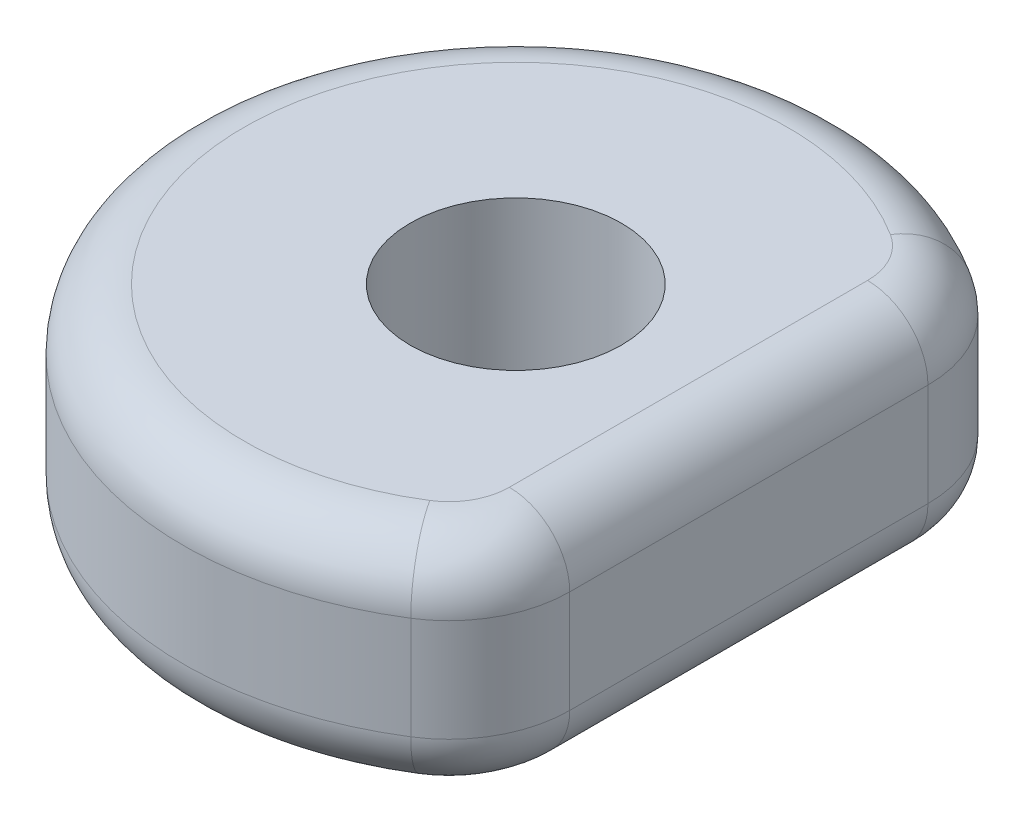
ISO-10303-21;
HEADER;
FILE_DESCRIPTION(('STEP AP214'),'2;1');
FILE_NAME('part.step','',(''),(''),'','','');
FILE_SCHEMA(('AUTOMOTIVE_DESIGN { 1 0 10303 214 1 1 1 1 }'));
ENDSEC;
DATA;
#1=APPLICATION_CONTEXT('core data for automotive mechanical design processes');
#2=APPLICATION_PROTOCOL_DEFINITION('international standard','automotive_design',2000,#1);
#3=PRODUCT_CONTEXT('',#1,'mechanical');
#4=PRODUCT('Part','Part','',(#3));
#5=PRODUCT_RELATED_PRODUCT_CATEGORY('part','',(#4));
#6=PRODUCT_DEFINITION_FORMATION('','',#4);
#7=PRODUCT_DEFINITION_CONTEXT('part definition',#1,'design');
#8=PRODUCT_DEFINITION('design','',#6,#7);
#9=PRODUCT_DEFINITION_SHAPE('','',#8);
#10=(LENGTH_UNIT() NAMED_UNIT(*) SI_UNIT(.MILLI.,.METRE.));
#11=(NAMED_UNIT(*) PLANE_ANGLE_UNIT() SI_UNIT($,.RADIAN.));
#12=(NAMED_UNIT(*) SI_UNIT($,.STERADIAN.) SOLID_ANGLE_UNIT());
#13=UNCERTAINTY_MEASURE_WITH_UNIT(LENGTH_MEASURE(1.E-05),#10,'distance_accuracy_value','');
#14=(GEOMETRIC_REPRESENTATION_CONTEXT(3) GLOBAL_UNCERTAINTY_ASSIGNED_CONTEXT((#13)) GLOBAL_UNIT_ASSIGNED_CONTEXT((#10,
#11,#12)) REPRESENTATION_CONTEXT('',''));
#15=CARTESIAN_POINT('',(0.,0.,0.));
#16=DIRECTION('',(0.,0.,1.));
#17=DIRECTION('',(1.,0.,0.));
#18=AXIS2_PLACEMENT_3D('',#15,#16,#17);
#19=CARTESIAN_POINT('',(0.,3.7,0.));
#20=DIRECTION('',(0.,1.,0.));
#21=DIRECTION('',(0.,0.,1.));
#22=AXIS2_PLACEMENT_3D('',#19,#20,#21);
#23=PLANE('',#22);
#24=DIRECTION('',(0.,0.,-1.));
#25=VECTOR('',#24,1.);
#26=CARTESIAN_POINT('',(2.85898782403715,3.7,-2.96549561963622));
#27=LINE('',#26,#25);
#28=CARTESIAN_POINT('',(2.85898782403715,3.7,2.96549561963622));
#29=VERTEX_POINT('',#28);
#30=CARTESIAN_POINT('',(2.85898782403715,3.7,-2.96549561963622));
#31=VERTEX_POINT('',#30);
#32=EDGE_CURVE('E142',#29,#31,#27,.T.);
#33=ORIENTED_EDGE('',*,*,#32,.T.);
#34=CARTESIAN_POINT('',(1.85898782403715,3.7,-2.96549561963622));
#35=DIRECTION('',(0.,1.,0.));
#36=DIRECTION('',(0.,0.,1.));
#37=AXIS2_PLACEMENT_3D('',#34,#35,#36);
#38=CIRCLE('',#37,1.);
#39=CARTESIAN_POINT('',(2.39012720233348,3.7,-3.81278008238943));
#40=VERTEX_POINT('',#39);
#41=EDGE_CURVE('E121',#31,#40,#38,.T.);
#42=ORIENTED_EDGE('',*,*,#41,.T.);
#43=CARTESIAN_POINT('',(0.,3.7,0.));
#44=DIRECTION('',(0.,1.,0.));
#45=DIRECTION('',(0.,0.,1.));
#46=AXIS2_PLACEMENT_3D('',#43,#44,#45);
#47=CIRCLE('',#46,4.5);
#48=CARTESIAN_POINT('',(2.39012720233348,3.7,3.81278008238943));
#49=VERTEX_POINT('',#48);
#50=EDGE_CURVE('E130',#40,#49,#47,.T.);
#51=ORIENTED_EDGE('',*,*,#50,.T.);
#52=CARTESIAN_POINT('',(1.85898782403715,3.7,2.96549561963622));
#53=DIRECTION('',(0.,1.,0.));
#54=DIRECTION('',(0.,0.,1.));
#55=AXIS2_PLACEMENT_3D('',#52,#53,#54);
#56=CIRCLE('',#55,1.);
#57=EDGE_CURVE('E137',#49,#29,#56,.T.);
#58=ORIENTED_EDGE('',*,*,#57,.T.);
#59=EDGE_LOOP('',(#33,#42,#51,#58));
#60=FACE_BOUND('',#59,.T.);
#61=CARTESIAN_POINT('',(0.,3.7,0.));
#62=DIRECTION('',(0.,1.,0.));
#63=DIRECTION('',(0.,0.,1.));
#64=AXIS2_PLACEMENT_3D('',#61,#62,#63);
#65=CIRCLE('',#64,1.75);
#66=CARTESIAN_POINT('',(0.,3.7,1.75));
#67=VERTEX_POINT('',#66);
#68=EDGE_CURVE('E231',#67,#67,#65,.T.);
#69=ORIENTED_EDGE('',*,*,#68,.F.);
#70=EDGE_LOOP('',(#69));
#71=FACE_BOUND('',#70,.T.);
#72=ADVANCED_FACE('F47',(#60,#71),#23,.T.);
#73=CARTESIAN_POINT('',(0.,0.,0.));
#74=DIRECTION('',(0.,1.,0.));
#75=DIRECTION('',(0.,0.,1.));
#76=AXIS2_PLACEMENT_3D('',#73,#74,#75);
#77=PLANE('',#76);
#78=CARTESIAN_POINT('',(0.,0.,0.));
#79=DIRECTION('',(0.,1.,0.));
#80=DIRECTION('',(0.,0.,1.));
#81=AXIS2_PLACEMENT_3D('',#78,#79,#80);
#82=CIRCLE('',#81,4.5);
#83=CARTESIAN_POINT('',(2.39012720233348,0.,3.81278008238943));
#84=VERTEX_POINT('',#83);
#85=CARTESIAN_POINT('',(2.39012720233348,0.,-3.81278008238943));
#86=VERTEX_POINT('',#85);
#87=EDGE_CURVE('E168',#84,#86,#82,.F.);
#88=ORIENTED_EDGE('',*,*,#87,.T.);
#89=CARTESIAN_POINT('',(1.85898782403715,0.,-2.96549561963622));
#90=DIRECTION('',(0.,1.,0.));
#91=DIRECTION('',(0.,0.,1.));
#92=AXIS2_PLACEMENT_3D('',#89,#90,#91);
#93=CIRCLE('',#92,1.);
#94=CARTESIAN_POINT('',(2.85898782403715,0.,-2.96549561963622));
#95=VERTEX_POINT('',#94);
#96=EDGE_CURVE('E176',#86,#95,#93,.F.);
#97=ORIENTED_EDGE('',*,*,#96,.T.);
#98=DIRECTION('',(0.,0.,-1.));
#99=VECTOR('',#98,1.);
#100=CARTESIAN_POINT('',(2.85898782403715,0.,0.));
#101=LINE('',#100,#99);
#102=CARTESIAN_POINT('',(2.85898782403715,0.,2.96549561963622));
#103=VERTEX_POINT('',#102);
#104=EDGE_CURVE('E72',#95,#103,#101,.F.);
#105=ORIENTED_EDGE('',*,*,#104,.T.);
#106=CARTESIAN_POINT('',(1.85898782403715,0.,2.96549561963622));
#107=DIRECTION('',(0.,1.,0.));
#108=DIRECTION('',(0.,0.,1.));
#109=AXIS2_PLACEMENT_3D('',#106,#107,#108);
#110=CIRCLE('',#109,1.);
#111=EDGE_CURVE('E171',#103,#84,#110,.F.);
#112=ORIENTED_EDGE('',*,*,#111,.T.);
#113=EDGE_LOOP('',(#88,#97,#105,#112));
#114=FACE_BOUND('',#113,.T.);
#115=CARTESIAN_POINT('',(0.,0.,0.));
#116=DIRECTION('',(0.,1.,0.));
#117=DIRECTION('',(0.,0.,1.));
#118=AXIS2_PLACEMENT_3D('',#115,#116,#117);
#119=CIRCLE('',#118,1.75);
#120=CARTESIAN_POINT('',(0.,0.,1.75));
#121=VERTEX_POINT('',#120);
#122=EDGE_CURVE('E189',#121,#121,#119,.T.);
#123=ORIENTED_EDGE('',*,*,#122,.T.);
#124=EDGE_LOOP('',(#123));
#125=FACE_BOUND('',#124,.T.);
#126=ADVANCED_FACE('F248',(#114,#125),#77,.F.);
#127=CARTESIAN_POINT('',(0.,3.7,0.));
#128=DIRECTION('',(0.,-1.,0.));
#129=DIRECTION('',(0.,0.,-1.));
#130=AXIS2_PLACEMENT_3D('',#127,#128,#129);
#131=CYLINDRICAL_SURFACE('',#130,5.5);
#132=DIRECTION('',(0.,-1.,0.));
#133=VECTOR('',#132,1.);
#134=CARTESIAN_POINT('',(2.92126658062981,3.7,4.66006454514263));
#135=LINE('',#134,#133);
#136=CARTESIAN_POINT('',(2.92126658062981,1.,4.66006454514263));
#137=VERTEX_POINT('',#136);
#138=CARTESIAN_POINT('',(2.92126658062981,2.7,4.66006454514263));
#139=VERTEX_POINT('',#138);
#140=EDGE_CURVE('E138',#137,#139,#135,.F.);
#141=ORIENTED_EDGE('',*,*,#140,.T.);
#142=CARTESIAN_POINT('',(0.,2.7,0.));
#143=DIRECTION('',(0.,1.,0.));
#144=DIRECTION('',(0.,0.,1.));
#145=AXIS2_PLACEMENT_3D('',#142,#143,#144);
#146=CIRCLE('',#145,5.5);
#147=CARTESIAN_POINT('',(2.92126658062981,2.7,-4.66006454514263));
#148=VERTEX_POINT('',#147);
#149=EDGE_CURVE('E11',#139,#148,#146,.F.);
#150=ORIENTED_EDGE('',*,*,#149,.T.);
#151=DIRECTION('',(0.,-1.,0.));
#152=VECTOR('',#151,1.);
#153=CARTESIAN_POINT('',(2.92126658062981,3.7,-4.66006454514263));
#154=LINE('',#153,#152);
#155=CARTESIAN_POINT('',(2.92126658062981,1.,-4.66006454514263));
#156=VERTEX_POINT('',#155);
#157=EDGE_CURVE('E224',#148,#156,#154,.T.);
#158=ORIENTED_EDGE('',*,*,#157,.T.);
#159=CARTESIAN_POINT('',(0.,1.,0.));
#160=DIRECTION('',(0.,1.,0.));
#161=DIRECTION('',(0.,0.,1.));
#162=AXIS2_PLACEMENT_3D('',#159,#160,#161);
#163=CIRCLE('',#162,5.5);
#164=EDGE_CURVE('E57',#156,#137,#163,.T.);
#165=ORIENTED_EDGE('',*,*,#164,.T.);
#166=EDGE_LOOP('',(#141,#150,#158,#165));
#167=FACE_BOUND('',#166,.T.);
#168=ADVANCED_FACE('F246',(#167),#131,.T.);
#169=CARTESIAN_POINT('',(3.85898782403715,3.7,-3.91895559734134));
#170=DIRECTION('',(-1.,0.,0.));
#171=DIRECTION('',(0.,0.,1.));
#172=AXIS2_PLACEMENT_3D('',#169,#170,#171);
#173=PLANE('',#172);
#174=DIRECTION('',(0.,-1.,0.));
#175=VECTOR('',#174,1.);
#176=CARTESIAN_POINT('',(3.85898782403715,3.7,-2.96549561963622));
#177=LINE('',#176,#175);
#178=CARTESIAN_POINT('',(3.85898782403715,1.,-2.96549561963622));
#179=VERTEX_POINT('',#178);
#180=CARTESIAN_POINT('',(3.85898782403715,2.7,-2.96549561963622));
#181=VERTEX_POINT('',#180);
#182=EDGE_CURVE('E225',#179,#181,#177,.F.);
#183=ORIENTED_EDGE('',*,*,#182,.T.);
#184=DIRECTION('',(0.,0.,-1.));
#185=VECTOR('',#184,1.);
#186=CARTESIAN_POINT('',(3.85898782403715,2.7,2.96549561963622));
#187=LINE('',#186,#185);
#188=CARTESIAN_POINT('',(3.85898782403715,2.7,2.96549561963622));
#189=VERTEX_POINT('',#188);
#190=EDGE_CURVE('E159',#181,#189,#187,.F.);
#191=ORIENTED_EDGE('',*,*,#190,.T.);
#192=DIRECTION('',(0.,-1.,0.));
#193=VECTOR('',#192,1.);
#194=CARTESIAN_POINT('',(3.85898782403715,3.7,2.96549561963622));
#195=LINE('',#194,#193);
#196=CARTESIAN_POINT('',(3.85898782403715,1.,2.96549561963622));
#197=VERTEX_POINT('',#196);
#198=EDGE_CURVE('E215',#189,#197,#195,.T.);
#199=ORIENTED_EDGE('',*,*,#198,.T.);
#200=DIRECTION('',(0.,0.,-1.));
#201=VECTOR('',#200,1.);
#202=CARTESIAN_POINT('',(3.85898782403715,1.,-3.91895559734134));
#203=LINE('',#202,#201);
#204=EDGE_CURVE('E156',#197,#179,#203,.T.);
#205=ORIENTED_EDGE('',*,*,#204,.T.);
#206=EDGE_LOOP('',(#183,#191,#199,#205));
#207=FACE_BOUND('',#206,.T.);
#208=ADVANCED_FACE('F220',(#207),#173,.F.);
#209=CARTESIAN_POINT('',(0.,3.7,0.));
#210=DIRECTION('',(0.,-1.,0.));
#211=DIRECTION('',(0.,0.,-1.));
#212=AXIS2_PLACEMENT_3D('',#209,#210,#211);
#213=CYLINDRICAL_SURFACE('',#212,1.75);
#214=ORIENTED_EDGE('',*,*,#68,.T.);
#215=EDGE_LOOP('',(#214));
#216=FACE_BOUND('',#215,.T.);
#217=ORIENTED_EDGE('',*,*,#122,.F.);
#218=EDGE_LOOP('',(#217));
#219=FACE_BOUND('',#218,.T.);
#220=ADVANCED_FACE('F254',(#216,#219),#213,.F.);
#221=CARTESIAN_POINT('',(1.85898782403715,3.7,2.96549561963622));
#222=DIRECTION('',(0.,-1.,0.));
#223=DIRECTION('',(0.,0.,-1.));
#224=AXIS2_PLACEMENT_3D('',#221,#222,#223);
#225=CYLINDRICAL_SURFACE('',#224,2.);
#226=ORIENTED_EDGE('',*,*,#198,.F.);
#227=CARTESIAN_POINT('',(1.85898782403715,2.7,2.96549561963622));
#228=DIRECTION('',(0.,1.,0.));
#229=DIRECTION('',(0.,0.,1.));
#230=AXIS2_PLACEMENT_3D('',#227,#228,#229);
#231=CIRCLE('',#230,2.);
#232=EDGE_CURVE('E165',#189,#139,#231,.F.);
#233=ORIENTED_EDGE('',*,*,#232,.T.);
#234=ORIENTED_EDGE('',*,*,#140,.F.);
#235=CARTESIAN_POINT('',(1.85898782403715,1.,2.96549561963622));
#236=DIRECTION('',(0.,1.,0.));
#237=DIRECTION('',(0.,0.,1.));
#238=AXIS2_PLACEMENT_3D('',#235,#236,#237);
#239=CIRCLE('',#238,2.);
#240=EDGE_CURVE('E162',#137,#197,#239,.T.);
#241=ORIENTED_EDGE('',*,*,#240,.T.);
#242=EDGE_LOOP('',(#226,#233,#234,#241));
#243=FACE_BOUND('',#242,.T.);
#244=ADVANCED_FACE('F214',(#243),#225,.T.);
#245=CARTESIAN_POINT('',(1.85898782403715,3.7,-2.96549561963622));
#246=DIRECTION('',(0.,-1.,0.));
#247=DIRECTION('',(0.,0.,-1.));
#248=AXIS2_PLACEMENT_3D('',#245,#246,#247);
#249=CYLINDRICAL_SURFACE('',#248,2.);
#250=ORIENTED_EDGE('',*,*,#157,.F.);
#251=CARTESIAN_POINT('',(1.85898782403715,2.7,-2.96549561963622));
#252=DIRECTION('',(0.,1.,0.));
#253=DIRECTION('',(0.,0.,1.));
#254=AXIS2_PLACEMENT_3D('',#251,#252,#253);
#255=CIRCLE('',#254,2.);
#256=EDGE_CURVE('E123',#148,#181,#255,.F.);
#257=ORIENTED_EDGE('',*,*,#256,.T.);
#258=ORIENTED_EDGE('',*,*,#182,.F.);
#259=CARTESIAN_POINT('',(1.85898782403715,1.,-2.96549561963622));
#260=DIRECTION('',(0.,1.,0.));
#261=DIRECTION('',(0.,0.,1.));
#262=AXIS2_PLACEMENT_3D('',#259,#260,#261);
#263=CIRCLE('',#262,2.);
#264=EDGE_CURVE('E145',#179,#156,#263,.T.);
#265=ORIENTED_EDGE('',*,*,#264,.T.);
#266=EDGE_LOOP('',(#250,#257,#258,#265));
#267=FACE_BOUND('',#266,.T.);
#268=ADVANCED_FACE('F244',(#267),#249,.T.);
#269=CARTESIAN_POINT('',(1.85898782403715,2.7,2.96549561963622));
#270=DIRECTION('',(0.,1.,0.));
#271=DIRECTION('',(0.,0.,1.));
#272=AXIS2_PLACEMENT_3D('',#269,#270,#271);
#273=DEGENERATE_TOROIDAL_SURFACE('',#272,1.,1.,.T.);
#274=CARTESIAN_POINT('',(2.39012720233348,2.7,3.81278008238943));
#275=DIRECTION('',(-0.847284462753206,0.,0.531139378296329));
#276=DIRECTION('',(0.531139378296329,0.,0.847284462753206));
#277=AXIS2_PLACEMENT_3D('',#274,#275,#276);
#278=CIRCLE('',#277,1.);
#279=EDGE_CURVE('E133',#139,#49,#278,.T.);
#280=ORIENTED_EDGE('',*,*,#279,.F.);
#281=ORIENTED_EDGE('',*,*,#232,.F.);
#282=CARTESIAN_POINT('',(2.85898782403715,2.7,2.96549561963622));
#283=DIRECTION('',(0.,0.,-1.));
#284=DIRECTION('',(-1.,0.,0.));
#285=AXIS2_PLACEMENT_3D('',#282,#283,#284);
#286=CIRCLE('',#285,1.);
#287=EDGE_CURVE('E185',#29,#189,#286,.T.);
#288=ORIENTED_EDGE('',*,*,#287,.F.);
#289=ORIENTED_EDGE('',*,*,#57,.F.);
#290=EDGE_LOOP('',(#280,#281,#288,#289));
#291=FACE_BOUND('',#290,.T.);
#292=ADVANCED_FACE('F239',(#291),#273,.T.);
#293=CARTESIAN_POINT('',(2.85898782403715,2.7,0.));
#294=DIRECTION('',(0.,0.,1.));
#295=DIRECTION('',(1.,0.,0.));
#296=AXIS2_PLACEMENT_3D('',#293,#294,#295);
#297=CYLINDRICAL_SURFACE('',#296,1.);
#298=ORIENTED_EDGE('',*,*,#287,.T.);
#299=ORIENTED_EDGE('',*,*,#190,.F.);
#300=CARTESIAN_POINT('',(2.85898782403715,2.7,-2.96549561963622));
#301=DIRECTION('',(0.,0.,-1.));
#302=DIRECTION('',(-1.,0.,0.));
#303=AXIS2_PLACEMENT_3D('',#300,#301,#302);
#304=CIRCLE('',#303,1.);
#305=EDGE_CURVE('E127',#31,#181,#304,.T.);
#306=ORIENTED_EDGE('',*,*,#305,.F.);
#307=ORIENTED_EDGE('',*,*,#32,.F.);
#308=EDGE_LOOP('',(#298,#299,#306,#307));
#309=FACE_BOUND('',#308,.T.);
#310=ADVANCED_FACE('F241',(#309),#297,.T.);
#311=CARTESIAN_POINT('',(0.,2.7,0.));
#312=DIRECTION('',(0.,1.,0.));
#313=DIRECTION('',(0.,0.,1.));
#314=AXIS2_PLACEMENT_3D('',#311,#312,#313);
#315=TOROIDAL_SURFACE('',#314,4.5,1.);
#316=ORIENTED_EDGE('',*,*,#279,.T.);
#317=ORIENTED_EDGE('',*,*,#50,.F.);
#318=CARTESIAN_POINT('',(2.39012720233348,2.7,-3.81278008238943));
#319=DIRECTION('',(0.847284462753206,0.,0.531139378296329));
#320=DIRECTION('',(0.531139378296329,0.,-0.847284462753206));
#321=AXIS2_PLACEMENT_3D('',#318,#319,#320);
#322=CIRCLE('',#321,1.);
#323=EDGE_CURVE('E117',#148,#40,#322,.T.);
#324=ORIENTED_EDGE('',*,*,#323,.F.);
#325=ORIENTED_EDGE('',*,*,#149,.F.);
#326=EDGE_LOOP('',(#316,#317,#324,#325));
#327=FACE_BOUND('',#326,.T.);
#328=ADVANCED_FACE('F131',(#327),#315,.T.);
#329=CARTESIAN_POINT('',(1.85898782403715,2.7,-2.96549561963622));
#330=DIRECTION('',(0.,1.,0.));
#331=DIRECTION('',(0.,0.,1.));
#332=AXIS2_PLACEMENT_3D('',#329,#330,#331);
#333=DEGENERATE_TOROIDAL_SURFACE('',#332,1.,1.,.T.);
#334=ORIENTED_EDGE('',*,*,#305,.T.);
#335=ORIENTED_EDGE('',*,*,#256,.F.);
#336=ORIENTED_EDGE('',*,*,#323,.T.);
#337=ORIENTED_EDGE('',*,*,#41,.F.);
#338=EDGE_LOOP('',(#334,#335,#336,#337));
#339=FACE_BOUND('',#338,.T.);
#340=ADVANCED_FACE('F119',(#339),#333,.T.);
#341=CARTESIAN_POINT('',(1.85898782403715,1.,2.96549561963622));
#342=DIRECTION('',(0.,1.,0.));
#343=DIRECTION('',(0.,0.,1.));
#344=AXIS2_PLACEMENT_3D('',#341,#342,#343);
#345=DEGENERATE_TOROIDAL_SURFACE('',#344,1.,1.,.T.);
#346=CARTESIAN_POINT('',(2.85898782403715,1.,2.96549561963622));
#347=DIRECTION('',(0.,0.,-1.));
#348=DIRECTION('',(-1.,0.,0.));
#349=AXIS2_PLACEMENT_3D('',#346,#347,#348);
#350=CIRCLE('',#349,1.);
#351=EDGE_CURVE('E194',#197,#103,#350,.T.);
#352=ORIENTED_EDGE('',*,*,#351,.F.);
#353=ORIENTED_EDGE('',*,*,#240,.F.);
#354=CARTESIAN_POINT('',(2.39012720233348,1.,3.81278008238943));
#355=DIRECTION('',(-0.847284462753206,0.,0.531139378296329));
#356=DIRECTION('',(0.531139378296329,0.,0.847284462753206));
#357=AXIS2_PLACEMENT_3D('',#354,#355,#356);
#358=CIRCLE('',#357,1.);
#359=EDGE_CURVE('E51',#84,#137,#358,.T.);
#360=ORIENTED_EDGE('',*,*,#359,.F.);
#361=ORIENTED_EDGE('',*,*,#111,.F.);
#362=EDGE_LOOP('',(#352,#353,#360,#361));
#363=FACE_BOUND('',#362,.T.);
#364=ADVANCED_FACE('F49',(#363),#345,.T.);
#365=CARTESIAN_POINT('',(0.,1.,0.));
#366=DIRECTION('',(0.,1.,0.));
#367=DIRECTION('',(0.,0.,1.));
#368=AXIS2_PLACEMENT_3D('',#365,#366,#367);
#369=TOROIDAL_SURFACE('',#368,4.5,1.);
#370=ORIENTED_EDGE('',*,*,#359,.T.);
#371=ORIENTED_EDGE('',*,*,#164,.F.);
#372=CARTESIAN_POINT('',(2.39012720233348,1.,-3.81278008238943));
#373=DIRECTION('',(0.847284462753206,0.,0.531139378296329));
#374=DIRECTION('',(0.531139378296329,0.,-0.847284462753206));
#375=AXIS2_PLACEMENT_3D('',#372,#373,#374);
#376=CIRCLE('',#375,1.);
#377=EDGE_CURVE('E192',#86,#156,#376,.T.);
#378=ORIENTED_EDGE('',*,*,#377,.F.);
#379=ORIENTED_EDGE('',*,*,#87,.F.);
#380=EDGE_LOOP('',(#370,#371,#378,#379));
#381=FACE_BOUND('',#380,.T.);
#382=ADVANCED_FACE('F206',(#381),#369,.T.);
#383=CARTESIAN_POINT('',(2.85898782403715,1.,-3.91895559734134));
#384=DIRECTION('',(0.,0.,-1.));
#385=DIRECTION('',(-1.,0.,0.));
#386=AXIS2_PLACEMENT_3D('',#383,#384,#385);
#387=CYLINDRICAL_SURFACE('',#386,1.);
#388=ORIENTED_EDGE('',*,*,#351,.T.);
#389=ORIENTED_EDGE('',*,*,#104,.F.);
#390=CARTESIAN_POINT('',(2.85898782403715,1.,-2.96549561963622));
#391=DIRECTION('',(0.,0.,-1.));
#392=DIRECTION('',(-1.,0.,0.));
#393=AXIS2_PLACEMENT_3D('',#390,#391,#392);
#394=CIRCLE('',#393,1.);
#395=EDGE_CURVE('E65',#179,#95,#394,.T.);
#396=ORIENTED_EDGE('',*,*,#395,.F.);
#397=ORIENTED_EDGE('',*,*,#204,.F.);
#398=EDGE_LOOP('',(#388,#389,#396,#397));
#399=FACE_BOUND('',#398,.T.);
#400=ADVANCED_FACE('F293',(#399),#387,.T.);
#401=CARTESIAN_POINT('',(1.85898782403715,1.,-2.96549561963622));
#402=DIRECTION('',(0.,1.,0.));
#403=DIRECTION('',(0.,0.,1.));
#404=AXIS2_PLACEMENT_3D('',#401,#402,#403);
#405=DEGENERATE_TOROIDAL_SURFACE('',#404,1.,1.,.T.);
#406=ORIENTED_EDGE('',*,*,#377,.T.);
#407=ORIENTED_EDGE('',*,*,#264,.F.);
#408=ORIENTED_EDGE('',*,*,#395,.T.);
#409=ORIENTED_EDGE('',*,*,#96,.F.);
#410=EDGE_LOOP('',(#406,#407,#408,#409));
#411=FACE_BOUND('',#410,.T.);
#412=ADVANCED_FACE('F290',(#411),#405,.T.);
#413=CLOSED_SHELL('',(#72,#126,#168,#208,#220,#244,#268,#292,#310,#328,#340,#364,#382,#400,#412));
#414=MANIFOLD_SOLID_BREP('B2',#413);
#415=ADVANCED_BREP_SHAPE_REPRESENTATION('',(#18,#414),#14);
#416=SHAPE_DEFINITION_REPRESENTATION(#9,#415);
ENDSEC;
END-ISO-10303-21;
